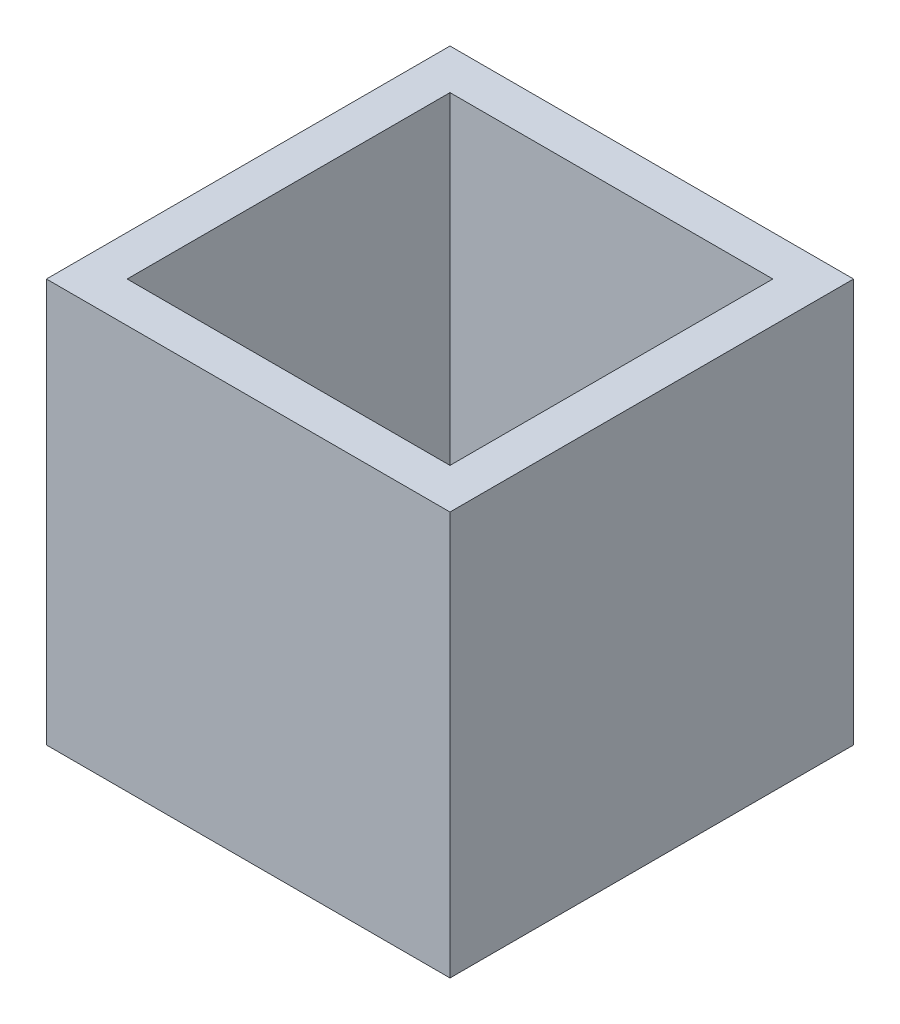
ISO-10303-21;
HEADER;
FILE_DESCRIPTION(('STEP AP214'),'2;1');
FILE_NAME('part.step','',(''),(''),'','','');
FILE_SCHEMA(('AUTOMOTIVE_DESIGN { 1 0 10303 214 1 1 1 1 }'));
ENDSEC;
DATA;
#1=APPLICATION_CONTEXT('core data for automotive mechanical design processes');
#2=APPLICATION_PROTOCOL_DEFINITION('international standard','automotive_design',2000,#1);
#3=PRODUCT_CONTEXT('',#1,'mechanical');
#4=PRODUCT('Part','Part','',(#3));
#5=PRODUCT_RELATED_PRODUCT_CATEGORY('part','',(#4));
#6=PRODUCT_DEFINITION_FORMATION('','',#4);
#7=PRODUCT_DEFINITION_CONTEXT('part definition',#1,'design');
#8=PRODUCT_DEFINITION('design','',#6,#7);
#9=PRODUCT_DEFINITION_SHAPE('','',#8);
#10=(LENGTH_UNIT() NAMED_UNIT(*) SI_UNIT(.MILLI.,.METRE.));
#11=(NAMED_UNIT(*) PLANE_ANGLE_UNIT() SI_UNIT($,.RADIAN.));
#12=(NAMED_UNIT(*) SI_UNIT($,.STERADIAN.) SOLID_ANGLE_UNIT());
#13=UNCERTAINTY_MEASURE_WITH_UNIT(LENGTH_MEASURE(1.E-05),#10,'distance_accuracy_value','');
#14=(GEOMETRIC_REPRESENTATION_CONTEXT(3) GLOBAL_UNCERTAINTY_ASSIGNED_CONTEXT((#13)) GLOBAL_UNIT_ASSIGNED_CONTEXT((#10,
#11,#12)) REPRESENTATION_CONTEXT('',''));
#15=CARTESIAN_POINT('',(0.,0.,0.));
#16=DIRECTION('',(0.,0.,1.));
#17=DIRECTION('',(1.,0.,0.));
#18=AXIS2_PLACEMENT_3D('',#15,#16,#17);
#19=CARTESIAN_POINT('',(0.,8.75,0.));
#20=DIRECTION('',(0.,-1.,0.));
#21=DIRECTION('',(0.,0.,-1.));
#22=AXIS2_PLACEMENT_3D('',#19,#20,#21);
#23=PLANE('',#22);
#24=DIRECTION('',(0.,0.,-1.));
#25=VECTOR('',#24,1.);
#26=CARTESIAN_POINT('',(7.5,8.75,7.5));
#27=LINE('',#26,#25);
#28=CARTESIAN_POINT('',(7.5,8.75,7.5));
#29=VERTEX_POINT('',#28);
#30=CARTESIAN_POINT('',(7.5,8.75,-7.5));
#31=VERTEX_POINT('',#30);
#32=EDGE_CURVE('E152',#29,#31,#27,.T.);
#33=ORIENTED_EDGE('',*,*,#32,.T.);
#34=DIRECTION('',(-1.,0.,0.));
#35=VECTOR('',#34,1.);
#36=CARTESIAN_POINT('',(-7.5,8.75,-7.5));
#37=LINE('',#36,#35);
#38=CARTESIAN_POINT('',(-7.5,8.75,-7.5));
#39=VERTEX_POINT('',#38);
#40=EDGE_CURVE('E156',#31,#39,#37,.T.);
#41=ORIENTED_EDGE('',*,*,#40,.T.);
#42=DIRECTION('',(0.,0.,1.));
#43=VECTOR('',#42,1.);
#44=CARTESIAN_POINT('',(-7.5,8.75,7.5));
#45=LINE('',#44,#43);
#46=CARTESIAN_POINT('',(-7.5,8.75,7.5));
#47=VERTEX_POINT('',#46);
#48=EDGE_CURVE('E160',#39,#47,#45,.T.);
#49=ORIENTED_EDGE('',*,*,#48,.T.);
#50=DIRECTION('',(1.,0.,0.));
#51=VECTOR('',#50,1.);
#52=CARTESIAN_POINT('',(-7.5,8.75,7.5));
#53=LINE('',#52,#51);
#54=EDGE_CURVE('E163',#47,#29,#53,.T.);
#55=ORIENTED_EDGE('',*,*,#54,.T.);
#56=EDGE_LOOP('',(#33,#41,#49,#55));
#57=FACE_BOUND('',#56,.T.);
#58=DIRECTION('',(0.,0.,-1.));
#59=VECTOR('',#58,1.);
#60=CARTESIAN_POINT('',(6.,8.75,6.));
#61=LINE('',#60,#59);
#62=CARTESIAN_POINT('',(6.,8.75,6.));
#63=VERTEX_POINT('',#62);
#64=CARTESIAN_POINT('',(6.,8.75,-6.));
#65=VERTEX_POINT('',#64);
#66=EDGE_CURVE('E104',#63,#65,#61,.T.);
#67=ORIENTED_EDGE('',*,*,#66,.F.);
#68=DIRECTION('',(1.,0.,0.));
#69=VECTOR('',#68,1.);
#70=CARTESIAN_POINT('',(-6.,8.75,6.));
#71=LINE('',#70,#69);
#72=CARTESIAN_POINT('',(-6.,8.75,6.));
#73=VERTEX_POINT('',#72);
#74=EDGE_CURVE('E130',#73,#63,#71,.T.);
#75=ORIENTED_EDGE('',*,*,#74,.F.);
#76=DIRECTION('',(0.,0.,1.));
#77=VECTOR('',#76,1.);
#78=CARTESIAN_POINT('',(-6.,8.75,6.));
#79=LINE('',#78,#77);
#80=CARTESIAN_POINT('',(-6.,8.75,-6.));
#81=VERTEX_POINT('',#80);
#82=EDGE_CURVE('E126',#81,#73,#79,.T.);
#83=ORIENTED_EDGE('',*,*,#82,.F.);
#84=DIRECTION('',(-1.,0.,0.));
#85=VECTOR('',#84,1.);
#86=CARTESIAN_POINT('',(-6.,8.75,-6.));
#87=LINE('',#86,#85);
#88=EDGE_CURVE('E113',#65,#81,#87,.T.);
#89=ORIENTED_EDGE('',*,*,#88,.F.);
#90=EDGE_LOOP('',(#67,#75,#83,#89));
#91=FACE_BOUND('',#90,.T.);
#92=ADVANCED_FACE('F38',(#57,#91),#23,.F.);
#93=CARTESIAN_POINT('',(0.,-6.25,0.));
#94=DIRECTION('',(0.,-1.,0.));
#95=DIRECTION('',(0.,0.,-1.));
#96=AXIS2_PLACEMENT_3D('',#93,#94,#95);
#97=PLANE('',#96);
#98=DIRECTION('',(0.,0.,-1.));
#99=VECTOR('',#98,1.);
#100=CARTESIAN_POINT('',(7.5,-6.25,7.5));
#101=LINE('',#100,#99);
#102=CARTESIAN_POINT('',(7.5,-6.25,7.5));
#103=VERTEX_POINT('',#102);
#104=CARTESIAN_POINT('',(7.5,-6.25,-7.5));
#105=VERTEX_POINT('',#104);
#106=EDGE_CURVE('E122',#103,#105,#101,.T.);
#107=ORIENTED_EDGE('',*,*,#106,.F.);
#108=DIRECTION('',(1.,0.,0.));
#109=VECTOR('',#108,1.);
#110=CARTESIAN_POINT('',(-7.5,-6.25,7.5));
#111=LINE('',#110,#109);
#112=CARTESIAN_POINT('',(-7.5,-6.25,7.5));
#113=VERTEX_POINT('',#112);
#114=EDGE_CURVE('E157',#113,#103,#111,.T.);
#115=ORIENTED_EDGE('',*,*,#114,.F.);
#116=DIRECTION('',(0.,0.,1.));
#117=VECTOR('',#116,1.);
#118=CARTESIAN_POINT('',(-7.5,-6.25,7.5));
#119=LINE('',#118,#117);
#120=CARTESIAN_POINT('',(-7.5,-6.25,-7.5));
#121=VERTEX_POINT('',#120);
#122=EDGE_CURVE('E173',#121,#113,#119,.T.);
#123=ORIENTED_EDGE('',*,*,#122,.F.);
#124=DIRECTION('',(-1.,0.,0.));
#125=VECTOR('',#124,1.);
#126=CARTESIAN_POINT('',(-7.5,-6.25,-7.5));
#127=LINE('',#126,#125);
#128=EDGE_CURVE('E170',#105,#121,#127,.T.);
#129=ORIENTED_EDGE('',*,*,#128,.F.);
#130=EDGE_LOOP('',(#107,#115,#123,#129));
#131=FACE_BOUND('',#130,.T.);
#132=DIRECTION('',(1.,0.,0.));
#133=VECTOR('',#132,1.);
#134=CARTESIAN_POINT('',(-6.,-6.25,6.));
#135=LINE('',#134,#133);
#136=CARTESIAN_POINT('',(-6.,-6.25,6.));
#137=VERTEX_POINT('',#136);
#138=CARTESIAN_POINT('',(6.,-6.25,6.));
#139=VERTEX_POINT('',#138);
#140=EDGE_CURVE('E114',#137,#139,#135,.T.);
#141=ORIENTED_EDGE('',*,*,#140,.T.);
#142=DIRECTION('',(0.,0.,-1.));
#143=VECTOR('',#142,1.);
#144=CARTESIAN_POINT('',(6.,-6.25,6.));
#145=LINE('',#144,#143);
#146=CARTESIAN_POINT('',(6.,-6.25,-6.));
#147=VERTEX_POINT('',#146);
#148=EDGE_CURVE('E62',#139,#147,#145,.T.);
#149=ORIENTED_EDGE('',*,*,#148,.T.);
#150=DIRECTION('',(-1.,0.,0.));
#151=VECTOR('',#150,1.);
#152=CARTESIAN_POINT('',(-6.,-6.25,-6.));
#153=LINE('',#152,#151);
#154=CARTESIAN_POINT('',(-6.,-6.25,-6.));
#155=VERTEX_POINT('',#154);
#156=EDGE_CURVE('E120',#147,#155,#153,.T.);
#157=ORIENTED_EDGE('',*,*,#156,.T.);
#158=DIRECTION('',(0.,0.,1.));
#159=VECTOR('',#158,1.);
#160=CARTESIAN_POINT('',(-6.,-6.25,6.));
#161=LINE('',#160,#159);
#162=EDGE_CURVE('E139',#155,#137,#161,.T.);
#163=ORIENTED_EDGE('',*,*,#162,.T.);
#164=EDGE_LOOP('',(#141,#149,#157,#163));
#165=FACE_BOUND('',#164,.T.);
#166=ADVANCED_FACE('F196',(#131,#165),#97,.T.);
#167=CARTESIAN_POINT('',(7.5,8.75,7.5));
#168=DIRECTION('',(-1.,0.,0.));
#169=DIRECTION('',(0.,0.,1.));
#170=AXIS2_PLACEMENT_3D('',#167,#168,#169);
#171=PLANE('',#170);
#172=ORIENTED_EDGE('',*,*,#106,.T.);
#173=DIRECTION('',(0.,-1.,0.));
#174=VECTOR('',#173,1.);
#175=CARTESIAN_POINT('',(7.5,8.75,-7.5));
#176=LINE('',#175,#174);
#177=EDGE_CURVE('E11',#31,#105,#176,.T.);
#178=ORIENTED_EDGE('',*,*,#177,.F.);
#179=ORIENTED_EDGE('',*,*,#32,.F.);
#180=DIRECTION('',(0.,-1.,0.));
#181=VECTOR('',#180,1.);
#182=CARTESIAN_POINT('',(7.5,8.75,7.5));
#183=LINE('',#182,#181);
#184=EDGE_CURVE('E166',#29,#103,#183,.T.);
#185=ORIENTED_EDGE('',*,*,#184,.T.);
#186=EDGE_LOOP('',(#172,#178,#179,#185));
#187=FACE_BOUND('',#186,.T.);
#188=ADVANCED_FACE('F40',(#187),#171,.F.);
#189=CARTESIAN_POINT('',(-7.5,8.75,-7.5));
#190=DIRECTION('',(0.,0.,1.));
#191=DIRECTION('',(1.,0.,0.));
#192=AXIS2_PLACEMENT_3D('',#189,#190,#191);
#193=PLANE('',#192);
#194=ORIENTED_EDGE('',*,*,#128,.T.);
#195=DIRECTION('',(0.,-1.,0.));
#196=VECTOR('',#195,1.);
#197=CARTESIAN_POINT('',(-7.5,8.75,-7.5));
#198=LINE('',#197,#196);
#199=EDGE_CURVE('E47',#39,#121,#198,.T.);
#200=ORIENTED_EDGE('',*,*,#199,.F.);
#201=ORIENTED_EDGE('',*,*,#40,.F.);
#202=ORIENTED_EDGE('',*,*,#177,.T.);
#203=EDGE_LOOP('',(#194,#200,#201,#202));
#204=FACE_BOUND('',#203,.T.);
#205=ADVANCED_FACE('F206',(#204),#193,.F.);
#206=CARTESIAN_POINT('',(-7.5,8.75,7.5));
#207=DIRECTION('',(1.,0.,0.));
#208=DIRECTION('',(0.,0.,-1.));
#209=AXIS2_PLACEMENT_3D('',#206,#207,#208);
#210=PLANE('',#209);
#211=ORIENTED_EDGE('',*,*,#122,.T.);
#212=DIRECTION('',(0.,-1.,0.));
#213=VECTOR('',#212,1.);
#214=CARTESIAN_POINT('',(-7.5,8.75,7.5));
#215=LINE('',#214,#213);
#216=EDGE_CURVE('E181',#47,#113,#215,.T.);
#217=ORIENTED_EDGE('',*,*,#216,.F.);
#218=ORIENTED_EDGE('',*,*,#48,.F.);
#219=ORIENTED_EDGE('',*,*,#199,.T.);
#220=EDGE_LOOP('',(#211,#217,#218,#219));
#221=FACE_BOUND('',#220,.T.);
#222=ADVANCED_FACE('F190',(#221),#210,.F.);
#223=CARTESIAN_POINT('',(-7.5,8.75,7.5));
#224=DIRECTION('',(0.,0.,-1.));
#225=DIRECTION('',(-1.,0.,0.));
#226=AXIS2_PLACEMENT_3D('',#223,#224,#225);
#227=PLANE('',#226);
#228=ORIENTED_EDGE('',*,*,#114,.T.);
#229=ORIENTED_EDGE('',*,*,#184,.F.);
#230=ORIENTED_EDGE('',*,*,#54,.F.);
#231=ORIENTED_EDGE('',*,*,#216,.T.);
#232=EDGE_LOOP('',(#228,#229,#230,#231));
#233=FACE_BOUND('',#232,.T.);
#234=ADVANCED_FACE('F200',(#233),#227,.F.);
#235=CARTESIAN_POINT('',(6.,8.75,6.));
#236=DIRECTION('',(-1.,0.,0.));
#237=DIRECTION('',(0.,0.,1.));
#238=AXIS2_PLACEMENT_3D('',#235,#236,#237);
#239=PLANE('',#238);
#240=ORIENTED_EDGE('',*,*,#148,.F.);
#241=DIRECTION('',(0.,-1.,0.));
#242=VECTOR('',#241,1.);
#243=CARTESIAN_POINT('',(6.,8.75,6.));
#244=LINE('',#243,#242);
#245=EDGE_CURVE('E108',#63,#139,#244,.T.);
#246=ORIENTED_EDGE('',*,*,#245,.F.);
#247=ORIENTED_EDGE('',*,*,#66,.T.);
#248=DIRECTION('',(0.,-1.,0.));
#249=VECTOR('',#248,1.);
#250=CARTESIAN_POINT('',(6.,8.75,-6.));
#251=LINE('',#250,#249);
#252=EDGE_CURVE('E107',#65,#147,#251,.T.);
#253=ORIENTED_EDGE('',*,*,#252,.T.);
#254=EDGE_LOOP('',(#240,#246,#247,#253));
#255=FACE_BOUND('',#254,.T.);
#256=ADVANCED_FACE('F106',(#255),#239,.T.);
#257=CARTESIAN_POINT('',(-6.,8.75,-6.));
#258=DIRECTION('',(0.,0.,1.));
#259=DIRECTION('',(1.,0.,0.));
#260=AXIS2_PLACEMENT_3D('',#257,#258,#259);
#261=PLANE('',#260);
#262=ORIENTED_EDGE('',*,*,#156,.F.);
#263=ORIENTED_EDGE('',*,*,#252,.F.);
#264=ORIENTED_EDGE('',*,*,#88,.T.);
#265=DIRECTION('',(0.,-1.,0.));
#266=VECTOR('',#265,1.);
#267=CARTESIAN_POINT('',(-6.,8.75,-6.));
#268=LINE('',#267,#266);
#269=EDGE_CURVE('E123',#81,#155,#268,.T.);
#270=ORIENTED_EDGE('',*,*,#269,.T.);
#271=EDGE_LOOP('',(#262,#263,#264,#270));
#272=FACE_BOUND('',#271,.T.);
#273=ADVANCED_FACE('F117',(#272),#261,.T.);
#274=CARTESIAN_POINT('',(-6.,8.75,6.));
#275=DIRECTION('',(1.,0.,0.));
#276=DIRECTION('',(0.,0.,-1.));
#277=AXIS2_PLACEMENT_3D('',#274,#275,#276);
#278=PLANE('',#277);
#279=ORIENTED_EDGE('',*,*,#162,.F.);
#280=ORIENTED_EDGE('',*,*,#269,.F.);
#281=ORIENTED_EDGE('',*,*,#82,.T.);
#282=DIRECTION('',(0.,-1.,0.));
#283=VECTOR('',#282,1.);
#284=CARTESIAN_POINT('',(-6.,8.75,6.));
#285=LINE('',#284,#283);
#286=EDGE_CURVE('E54',#73,#137,#285,.T.);
#287=ORIENTED_EDGE('',*,*,#286,.T.);
#288=EDGE_LOOP('',(#279,#280,#281,#287));
#289=FACE_BOUND('',#288,.T.);
#290=ADVANCED_FACE('F229',(#289),#278,.T.);
#291=CARTESIAN_POINT('',(-6.,8.75,6.));
#292=DIRECTION('',(0.,0.,-1.));
#293=DIRECTION('',(-1.,0.,0.));
#294=AXIS2_PLACEMENT_3D('',#291,#292,#293);
#295=PLANE('',#294);
#296=ORIENTED_EDGE('',*,*,#140,.F.);
#297=ORIENTED_EDGE('',*,*,#286,.F.);
#298=ORIENTED_EDGE('',*,*,#74,.T.);
#299=ORIENTED_EDGE('',*,*,#245,.T.);
#300=EDGE_LOOP('',(#296,#297,#298,#299));
#301=FACE_BOUND('',#300,.T.);
#302=ADVANCED_FACE('F233',(#301),#295,.T.);
#303=CLOSED_SHELL('',(#92,#166,#188,#205,#222,#234,#256,#273,#290,#302));
#304=MANIFOLD_SOLID_BREP('B2',#303);
#305=ADVANCED_BREP_SHAPE_REPRESENTATION('',(#18,#304),#14);
#306=SHAPE_DEFINITION_REPRESENTATION(#9,#305);
ENDSEC;
END-ISO-10303-21;
